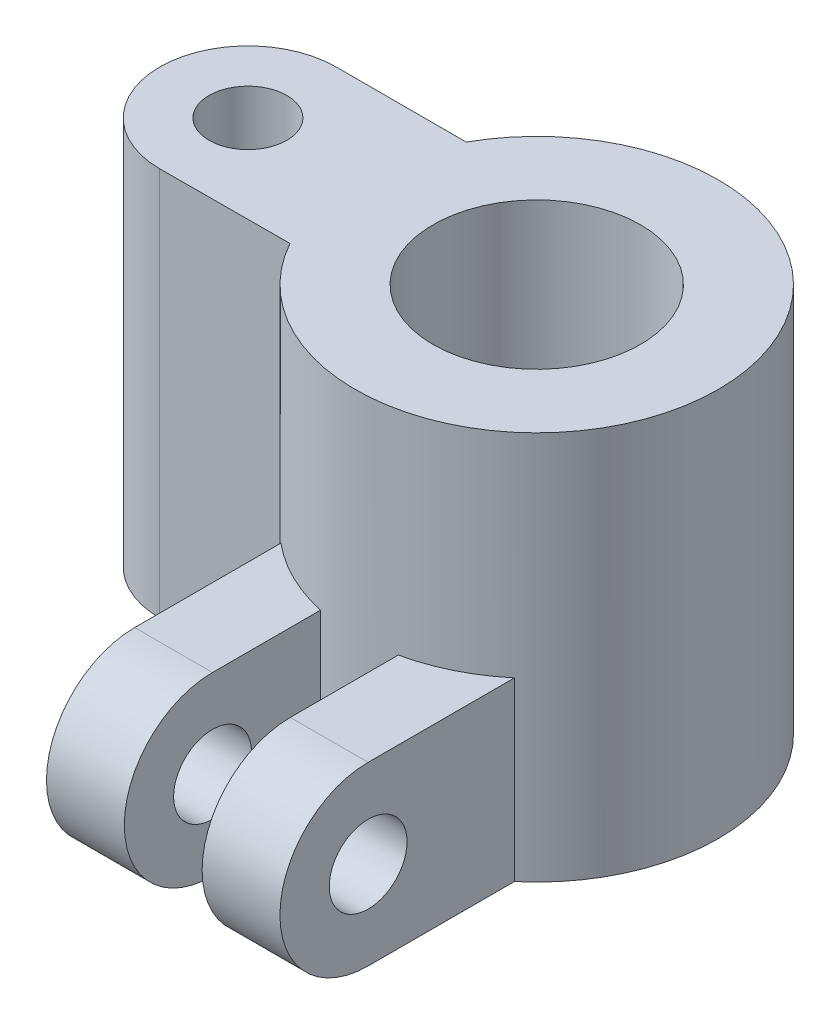
ISO-10303-21;
HEADER;
FILE_DESCRIPTION(('STEP AP214'),'2;1');
FILE_NAME('part.step','',(''),(''),'','','');
FILE_SCHEMA(('AUTOMOTIVE_DESIGN { 1 0 10303 214 1 1 1 1 }'));
ENDSEC;
DATA;
#1=APPLICATION_CONTEXT('core data for automotive mechanical design processes');
#2=APPLICATION_PROTOCOL_DEFINITION('international standard','automotive_design',2000,#1);
#3=PRODUCT_CONTEXT('',#1,'mechanical');
#4=PRODUCT('Part','Part','',(#3));
#5=PRODUCT_RELATED_PRODUCT_CATEGORY('part','',(#4));
#6=PRODUCT_DEFINITION_FORMATION('','',#4);
#7=PRODUCT_DEFINITION_CONTEXT('part definition',#1,'design');
#8=PRODUCT_DEFINITION('design','',#6,#7);
#9=PRODUCT_DEFINITION_SHAPE('','',#8);
#10=(LENGTH_UNIT() NAMED_UNIT(*) SI_UNIT(.MILLI.,.METRE.));
#11=(NAMED_UNIT(*) PLANE_ANGLE_UNIT() SI_UNIT($,.RADIAN.));
#12=(NAMED_UNIT(*) SI_UNIT($,.STERADIAN.) SOLID_ANGLE_UNIT());
#13=UNCERTAINTY_MEASURE_WITH_UNIT(LENGTH_MEASURE(1.E-05),#10,'distance_accuracy_value','');
#14=(GEOMETRIC_REPRESENTATION_CONTEXT(3) GLOBAL_UNCERTAINTY_ASSIGNED_CONTEXT((#13)) GLOBAL_UNIT_ASSIGNED_CONTEXT((#10,
#11,#12)) REPRESENTATION_CONTEXT('',''));
#15=CARTESIAN_POINT('',(0.,0.,0.));
#16=DIRECTION('',(0.,0.,1.));
#17=DIRECTION('',(1.,0.,0.));
#18=AXIS2_PLACEMENT_3D('',#15,#16,#17);
#19=CARTESIAN_POINT('',(7.500000000001,34.,1.02533666085625E-13));
#20=DIRECTION('',(1.,0.,0.));
#21=DIRECTION('',(0.,0.,-1.));
#22=AXIS2_PLACEMENT_3D('',#19,#20,#21);
#23=PLANE('',#22);
#24=CARTESIAN_POINT('',(7.50000000000024,17.,54.9999999999999));
#25=DIRECTION('',(1.,0.,0.));
#26=DIRECTION('',(0.,0.,-1.));
#27=AXIS2_PLACEMENT_3D('',#24,#25,#26);
#28=CIRCLE('',#27,7.5);
#29=CARTESIAN_POINT('',(7.50000000000034,17.,47.4999999999999));
#30=VERTEX_POINT('',#29);
#31=EDGE_CURVE('E340',#30,#30,#28,.F.);
#32=ORIENTED_EDGE('',*,*,#31,.F.);
#33=EDGE_LOOP('',(#32));
#34=FACE_BOUND('',#33,.T.);
#35=DIRECTION('',(0.,0.,1.));
#36=VECTOR('',#35,1.);
#37=CARTESIAN_POINT('',(7.500000000001,0.,1.02533666085625E-13));
#38=LINE('',#37,#36);
#39=CARTESIAN_POINT('',(7.50000000000053,0.,34.1869858279432));
#40=VERTEX_POINT('',#39);
#41=CARTESIAN_POINT('',(7.50000000000012,0.,54.9999999999999));
#42=VERTEX_POINT('',#41);
#43=EDGE_CURVE('E234',#40,#42,#38,.T.);
#44=ORIENTED_EDGE('',*,*,#43,.T.);
#45=CARTESIAN_POINT('',(7.50000000000024,17.,54.9999999999999));
#46=DIRECTION('',(1.,0.,0.));
#47=DIRECTION('',(0.,0.,-1.));
#48=AXIS2_PLACEMENT_3D('',#45,#46,#47);
#49=CIRCLE('',#48,17.);
#50=CARTESIAN_POINT('',(7.50000000000025,34.,54.9999999999998));
#51=VERTEX_POINT('',#50);
#52=EDGE_CURVE('E219',#42,#51,#49,.F.);
#53=ORIENTED_EDGE('',*,*,#52,.T.);
#54=DIRECTION('',(0.,0.,1.));
#55=VECTOR('',#54,1.);
#56=CARTESIAN_POINT('',(7.500000000001,34.,1.02533666085625E-13));
#57=LINE('',#56,#55);
#58=CARTESIAN_POINT('',(7.50000000000052,34.,34.1869858279432));
#59=VERTEX_POINT('',#58);
#60=EDGE_CURVE('E236',#59,#51,#57,.T.);
#61=ORIENTED_EDGE('',*,*,#60,.F.);
#62=DIRECTION('',(0.,-1.,0.));
#63=VECTOR('',#62,1.);
#64=CARTESIAN_POINT('',(7.50000000000053,34.,34.1869858279433));
#65=LINE('',#64,#63);
#66=EDGE_CURVE('E244',#59,#40,#65,.T.);
#67=ORIENTED_EDGE('',*,*,#66,.T.);
#68=EDGE_LOOP('',(#44,#53,#61,#67));
#69=FACE_BOUND('',#68,.T.);
#70=ADVANCED_FACE('F123',(#34,#69),#23,.F.);
#71=CARTESIAN_POINT('',(22.5000000000003,34.,-1.53739603596427E-13));
#72=DIRECTION('',(1.,0.,0.));
#73=DIRECTION('',(0.,0.,-1.));
#74=AXIS2_PLACEMENT_3D('',#71,#72,#73);
#75=PLANE('',#74);
#76=CARTESIAN_POINT('',(22.5000000000007,17.,54.9999999999998));
#77=DIRECTION('',(1.,0.,0.));
#78=DIRECTION('',(0.,0.,-1.));
#79=AXIS2_PLACEMENT_3D('',#76,#77,#78);
#80=CIRCLE('',#79,7.5);
#81=CARTESIAN_POINT('',(22.5000000000006,17.,47.4999999999998));
#82=VERTEX_POINT('',#81);
#83=EDGE_CURVE('E343',#82,#82,#80,.T.);
#84=ORIENTED_EDGE('',*,*,#83,.F.);
#85=EDGE_LOOP('',(#84));
#86=FACE_BOUND('',#85,.T.);
#87=CARTESIAN_POINT('',(22.5000000000007,17.,54.9999999999998));
#88=DIRECTION('',(1.,0.,0.));
#89=DIRECTION('',(0.,0.,-1.));
#90=AXIS2_PLACEMENT_3D('',#87,#88,#89);
#91=CIRCLE('',#90,17.);
#92=CARTESIAN_POINT('',(22.5000000000007,34.,54.9999999999998));
#93=VERTEX_POINT('',#92);
#94=CARTESIAN_POINT('',(22.5000000000007,0.,54.9999999999998));
#95=VERTEX_POINT('',#94);
#96=EDGE_CURVE('E138',#93,#95,#91,.T.);
#97=ORIENTED_EDGE('',*,*,#96,.T.);
#98=DIRECTION('',(0.,0.,1.));
#99=VECTOR('',#98,1.);
#100=CARTESIAN_POINT('',(22.5000000000003,0.,-1.53739603596427E-13));
#101=LINE('',#100,#99);
#102=CARTESIAN_POINT('',(22.5000000000005,0.,26.8095132369089));
#103=VERTEX_POINT('',#102);
#104=EDGE_CURVE('E215',#103,#95,#101,.T.);
#105=ORIENTED_EDGE('',*,*,#104,.F.);
#106=DIRECTION('',(0.,-1.,0.));
#107=VECTOR('',#106,1.);
#108=CARTESIAN_POINT('',(22.5000000000005,34.,26.8095132369089));
#109=LINE('',#108,#107);
#110=CARTESIAN_POINT('',(22.5000000000003,34.,26.8095132369087));
#111=VERTEX_POINT('',#110);
#112=EDGE_CURVE('E242',#111,#103,#109,.T.);
#113=ORIENTED_EDGE('',*,*,#112,.F.);
#114=DIRECTION('',(0.,0.,1.));
#115=VECTOR('',#114,1.);
#116=CARTESIAN_POINT('',(22.5000000000003,34.,-1.53739603596427E-13));
#117=LINE('',#116,#115);
#118=EDGE_CURVE('E217',#111,#93,#117,.T.);
#119=ORIENTED_EDGE('',*,*,#118,.T.);
#120=EDGE_LOOP('',(#97,#105,#113,#119));
#121=FACE_BOUND('',#120,.T.);
#122=ADVANCED_FACE('F212',(#86,#121),#75,.T.);
#123=CARTESIAN_POINT('',(0.,0.,0.));
#124=DIRECTION('',(0.,1.,0.));
#125=DIRECTION('',(0.,0.,1.));
#126=AXIS2_PLACEMENT_3D('',#123,#124,#125);
#127=PLANE('',#126);
#128=CARTESIAN_POINT('',(0.,0.,0.));
#129=DIRECTION('',(0.,1.,0.));
#130=DIRECTION('',(0.,0.,1.));
#131=AXIS2_PLACEMENT_3D('',#128,#129,#130);
#132=CIRCLE('',#131,20.);
#133=CARTESIAN_POINT('',(0.,0.,20.));
#134=VERTEX_POINT('',#133);
#135=EDGE_CURVE('E287',#134,#134,#132,.T.);
#136=ORIENTED_EDGE('',*,*,#135,.T.);
#137=EDGE_LOOP('',(#136));
#138=FACE_BOUND('',#137,.T.);
#139=CARTESIAN_POINT('',(-55.6683295772882,0.,0.));
#140=DIRECTION('',(0.,1.,0.));
#141=DIRECTION('',(0.,0.,1.));
#142=AXIS2_PLACEMENT_3D('',#139,#140,#141);
#143=CIRCLE('',#142,7.5);
#144=CARTESIAN_POINT('',(-55.6683295772882,0.,7.5));
#145=VERTEX_POINT('',#144);
#146=EDGE_CURVE('E267',#145,#145,#143,.T.);
#147=ORIENTED_EDGE('',*,*,#146,.T.);
#148=EDGE_LOOP('',(#147));
#149=FACE_BOUND('',#148,.T.);
#150=DIRECTION('',(1.,0.,0.));
#151=VECTOR('',#150,1.);
#152=CARTESIAN_POINT('',(-72.6693295772883,0.,55.0000000000005));
#153=LINE('',#152,#151);
#154=EDGE_CURVE('E222',#42,#95,#153,.T.);
#155=ORIENTED_EDGE('',*,*,#154,.F.);
#156=ORIENTED_EDGE('',*,*,#43,.F.);
#157=CARTESIAN_POINT('',(0.,0.,0.));
#158=DIRECTION('',(0.,1.,0.));
#159=DIRECTION('',(0.,0.,1.));
#160=AXIS2_PLACEMENT_3D('',#157,#158,#159);
#161=CIRCLE('',#160,35.);
#162=CARTESIAN_POINT('',(-7.49999999999999,0.,34.1869858279434));
#163=VERTEX_POINT('',#162);
#164=EDGE_CURVE('E293',#163,#40,#161,.T.);
#165=ORIENTED_EDGE('',*,*,#164,.F.);
#166=DIRECTION('',(0.,0.,1.));
#167=VECTOR('',#166,1.);
#168=CARTESIAN_POINT('',(-7.49999999999999,0.,0.));
#169=LINE('',#168,#167);
#170=CARTESIAN_POINT('',(-7.49999999999999,0.,55.));
#171=VERTEX_POINT('',#170);
#172=EDGE_CURVE('E251',#163,#171,#169,.T.);
#173=ORIENTED_EDGE('',*,*,#172,.T.);
#174=DIRECTION('',(-1.,0.,0.));
#175=VECTOR('',#174,1.);
#176=CARTESIAN_POINT('',(35.001,0.,55.));
#177=LINE('',#176,#175);
#178=CARTESIAN_POINT('',(-22.5,0.,55.));
#179=VERTEX_POINT('',#178);
#180=EDGE_CURVE('E146',#171,#179,#177,.T.);
#181=ORIENTED_EDGE('',*,*,#180,.T.);
#182=DIRECTION('',(0.,0.,1.));
#183=VECTOR('',#182,1.);
#184=CARTESIAN_POINT('',(-22.5,0.,0.));
#185=LINE('',#184,#183);
#186=CARTESIAN_POINT('',(-22.5,0.,26.809513236909));
#187=VERTEX_POINT('',#186);
#188=EDGE_CURVE('E247',#187,#179,#185,.T.);
#189=ORIENTED_EDGE('',*,*,#188,.F.);
#190=CARTESIAN_POINT('',(-30.643296935823,0.,16.9111901681395));
#191=VERTEX_POINT('',#190);
#192=EDGE_CURVE('E290',#191,#187,#161,.T.);
#193=ORIENTED_EDGE('',*,*,#192,.F.);
#194=DIRECTION('',(0.999993702927513,0.,-0.00354881745374228));
#195=VECTOR('',#194,1.);
#196=CARTESIAN_POINT('',(0.059628424006202,0.,16.8022304046141));
#197=LINE('',#196,#195);
#198=CARTESIAN_POINT('',(-55.6683295772882,0.,17.));
#199=VERTEX_POINT('',#198);
#200=EDGE_CURVE('E272',#199,#191,#197,.T.);
#201=ORIENTED_EDGE('',*,*,#200,.F.);
#202=CARTESIAN_POINT('',(-55.6683295772882,0.,0.));
#203=DIRECTION('',(0.,1.,0.));
#204=DIRECTION('',(0.,0.,1.));
#205=AXIS2_PLACEMENT_3D('',#202,#203,#204);
#206=CIRCLE('',#205,17.);
#207=CARTESIAN_POINT('',(-55.6683295772882,0.,-17.));
#208=VERTEX_POINT('',#207);
#209=EDGE_CURVE('E295',#208,#199,#206,.T.);
#210=ORIENTED_EDGE('',*,*,#209,.F.);
#211=DIRECTION('',(1.,0.,0.));
#212=VECTOR('',#211,1.);
#213=CARTESIAN_POINT('',(0.,0.,-17.));
#214=LINE('',#213,#212);
#215=CARTESIAN_POINT('',(-30.5941170815567,0.,-17.));
#216=VERTEX_POINT('',#215);
#217=EDGE_CURVE('E292',#208,#216,#214,.T.);
#218=ORIENTED_EDGE('',*,*,#217,.T.);
#219=EDGE_CURVE('E231',#103,#216,#161,.T.);
#220=ORIENTED_EDGE('',*,*,#219,.F.);
#221=ORIENTED_EDGE('',*,*,#104,.T.);
#222=EDGE_LOOP('',(#155,#156,#165,#173,#181,#189,#193,#201,#210,#218,#220,#221));
#223=FACE_BOUND('',#222,.T.);
#224=ADVANCED_FACE('F229',(#138,#149,#223),#127,.F.);
#225=CARTESIAN_POINT('',(0.,34.,0.));
#226=DIRECTION('',(0.,1.,0.));
#227=DIRECTION('',(0.,0.,1.));
#228=AXIS2_PLACEMENT_3D('',#225,#226,#227);
#229=PLANE('',#228);
#230=ORIENTED_EDGE('',*,*,#60,.T.);
#231=DIRECTION('',(1.,0.,0.));
#232=VECTOR('',#231,1.);
#233=CARTESIAN_POINT('',(-72.6693295772883,34.,55.0000000000004));
#234=LINE('',#233,#232);
#235=EDGE_CURVE('E218',#51,#93,#234,.T.);
#236=ORIENTED_EDGE('',*,*,#235,.T.);
#237=ORIENTED_EDGE('',*,*,#118,.F.);
#238=CARTESIAN_POINT('',(0.,34.,0.));
#239=DIRECTION('',(0.,1.,0.));
#240=DIRECTION('',(0.,0.,1.));
#241=AXIS2_PLACEMENT_3D('',#238,#239,#240);
#242=CIRCLE('',#241,35.);
#243=EDGE_CURVE('E233',#59,#111,#242,.T.);
#244=ORIENTED_EDGE('',*,*,#243,.F.);
#245=EDGE_LOOP('',(#230,#236,#237,#244));
#246=FACE_BOUND('',#245,.T.);
#247=ADVANCED_FACE('F325',(#246),#229,.T.);
#248=CARTESIAN_POINT('',(-22.5,34.,0.));
#249=DIRECTION('',(1.,0.,0.));
#250=DIRECTION('',(0.,0.,-1.));
#251=AXIS2_PLACEMENT_3D('',#248,#249,#250);
#252=PLANE('',#251);
#253=CARTESIAN_POINT('',(-22.5,17.,55.));
#254=DIRECTION('',(-1.,0.,0.));
#255=DIRECTION('',(0.,0.,1.));
#256=AXIS2_PLACEMENT_3D('',#253,#254,#255);
#257=CIRCLE('',#256,7.5);
#258=CARTESIAN_POINT('',(-22.5,17.,62.5));
#259=VERTEX_POINT('',#258);
#260=EDGE_CURVE('E334',#259,#259,#257,.T.);
#261=ORIENTED_EDGE('',*,*,#260,.F.);
#262=EDGE_LOOP('',(#261));
#263=FACE_BOUND('',#262,.T.);
#264=CARTESIAN_POINT('',(-22.5,17.,55.));
#265=DIRECTION('',(-1.,0.,0.));
#266=DIRECTION('',(0.,0.,1.));
#267=AXIS2_PLACEMENT_3D('',#264,#265,#266);
#268=CIRCLE('',#267,17.);
#269=CARTESIAN_POINT('',(-22.5,34.,55.));
#270=VERTEX_POINT('',#269);
#271=EDGE_CURVE('E328',#179,#270,#268,.T.);
#272=ORIENTED_EDGE('',*,*,#271,.T.);
#273=DIRECTION('',(0.,0.,1.));
#274=VECTOR('',#273,1.);
#275=CARTESIAN_POINT('',(-22.5,34.,0.));
#276=LINE('',#275,#274);
#277=CARTESIAN_POINT('',(-22.5,34.,26.809513236909));
#278=VERTEX_POINT('',#277);
#279=EDGE_CURVE('E250',#278,#270,#276,.T.);
#280=ORIENTED_EDGE('',*,*,#279,.F.);
#281=DIRECTION('',(0.,-1.,0.));
#282=VECTOR('',#281,1.);
#283=CARTESIAN_POINT('',(-22.5,34.,26.809513236909));
#284=LINE('',#283,#282);
#285=EDGE_CURVE('E264',#278,#187,#284,.T.);
#286=ORIENTED_EDGE('',*,*,#285,.T.);
#287=ORIENTED_EDGE('',*,*,#188,.T.);
#288=EDGE_LOOP('',(#272,#280,#286,#287));
#289=FACE_BOUND('',#288,.T.);
#290=ADVANCED_FACE('F374',(#263,#289),#252,.F.);
#291=CARTESIAN_POINT('',(-7.49999999999999,34.,0.));
#292=DIRECTION('',(1.,0.,0.));
#293=DIRECTION('',(0.,0.,-1.));
#294=AXIS2_PLACEMENT_3D('',#291,#292,#293);
#295=PLANE('',#294);
#296=CARTESIAN_POINT('',(-7.49999999999999,17.,55.));
#297=DIRECTION('',(1.,0.,0.));
#298=DIRECTION('',(0.,0.,-1.));
#299=AXIS2_PLACEMENT_3D('',#296,#297,#298);
#300=CIRCLE('',#299,7.5);
#301=CARTESIAN_POINT('',(-7.49999999999999,17.,62.5));
#302=VERTEX_POINT('',#301);
#303=EDGE_CURVE('E337',#302,#302,#300,.F.);
#304=ORIENTED_EDGE('',*,*,#303,.T.);
#305=EDGE_LOOP('',(#304));
#306=FACE_BOUND('',#305,.T.);
#307=DIRECTION('',(0.,0.,1.));
#308=VECTOR('',#307,1.);
#309=CARTESIAN_POINT('',(-7.49999999999999,34.,0.));
#310=LINE('',#309,#308);
#311=CARTESIAN_POINT('',(-7.49999999999999,34.,34.1869858279434));
#312=VERTEX_POINT('',#311);
#313=CARTESIAN_POINT('',(-7.49999999999999,34.,55.));
#314=VERTEX_POINT('',#313);
#315=EDGE_CURVE('E254',#312,#314,#310,.T.);
#316=ORIENTED_EDGE('',*,*,#315,.T.);
#317=CARTESIAN_POINT('',(-7.49999999999999,17.,55.));
#318=DIRECTION('',(1.,0.,0.));
#319=DIRECTION('',(0.,0.,-1.));
#320=AXIS2_PLACEMENT_3D('',#317,#318,#319);
#321=CIRCLE('',#320,17.);
#322=EDGE_CURVE('E238',#171,#314,#321,.F.);
#323=ORIENTED_EDGE('',*,*,#322,.F.);
#324=ORIENTED_EDGE('',*,*,#172,.F.);
#325=DIRECTION('',(0.,-1.,0.));
#326=VECTOR('',#325,1.);
#327=CARTESIAN_POINT('',(-7.49999999999999,34.,34.1869858279434));
#328=LINE('',#327,#326);
#329=EDGE_CURVE('E257',#312,#163,#328,.T.);
#330=ORIENTED_EDGE('',*,*,#329,.F.);
#331=EDGE_LOOP('',(#316,#323,#324,#330));
#332=FACE_BOUND('',#331,.T.);
#333=ADVANCED_FACE('F371',(#306,#332),#295,.T.);
#334=CARTESIAN_POINT('',(0.,75.,0.));
#335=DIRECTION('',(0.,-1.,0.));
#336=DIRECTION('',(0.,0.,-1.));
#337=AXIS2_PLACEMENT_3D('',#334,#335,#336);
#338=CYLINDRICAL_SURFACE('',#337,35.);
#339=ORIENTED_EDGE('',*,*,#66,.F.);
#340=ORIENTED_EDGE('',*,*,#243,.T.);
#341=ORIENTED_EDGE('',*,*,#112,.T.);
#342=ORIENTED_EDGE('',*,*,#219,.T.);
#343=DIRECTION('',(0.,-1.,0.));
#344=VECTOR('',#343,1.);
#345=CARTESIAN_POINT('',(-30.5941170815567,75.,-17.));
#346=LINE('',#345,#344);
#347=CARTESIAN_POINT('',(-30.5941170815567,75.,-17.));
#348=VERTEX_POINT('',#347);
#349=EDGE_CURVE('E12',#348,#216,#346,.T.);
#350=ORIENTED_EDGE('',*,*,#349,.F.);
#351=CARTESIAN_POINT('',(0.,75.,0.));
#352=DIRECTION('',(0.,1.,0.));
#353=DIRECTION('',(0.,0.,1.));
#354=AXIS2_PLACEMENT_3D('',#351,#352,#353);
#355=CIRCLE('',#354,35.);
#356=CARTESIAN_POINT('',(-30.643296935823,75.,16.9111901681395));
#357=VERTEX_POINT('',#356);
#358=EDGE_CURVE('E275',#357,#348,#355,.T.);
#359=ORIENTED_EDGE('',*,*,#358,.F.);
#360=DIRECTION('',(0.,-1.,0.));
#361=VECTOR('',#360,1.);
#362=CARTESIAN_POINT('',(-30.643296935823,75.,16.9111901681395));
#363=LINE('',#362,#361);
#364=EDGE_CURVE('E284',#357,#191,#363,.T.);
#365=ORIENTED_EDGE('',*,*,#364,.T.);
#366=ORIENTED_EDGE('',*,*,#192,.T.);
#367=ORIENTED_EDGE('',*,*,#285,.F.);
#368=CARTESIAN_POINT('',(0.,34.,0.));
#369=DIRECTION('',(0.,1.,0.));
#370=DIRECTION('',(0.,0.,1.));
#371=AXIS2_PLACEMENT_3D('',#368,#369,#370);
#372=CIRCLE('',#371,35.);
#373=EDGE_CURVE('E248',#278,#312,#372,.T.);
#374=ORIENTED_EDGE('',*,*,#373,.T.);
#375=ORIENTED_EDGE('',*,*,#329,.T.);
#376=ORIENTED_EDGE('',*,*,#164,.T.);
#377=EDGE_LOOP('',(#339,#340,#341,#342,#350,#359,#365,#366,#367,#374,#375,#376));
#378=FACE_BOUND('',#377,.T.);
#379=ADVANCED_FACE('F316',(#378),#338,.T.);
#380=CARTESIAN_POINT('',(0.,75.,-17.));
#381=DIRECTION('',(0.,0.,-1.));
#382=DIRECTION('',(-1.,0.,0.));
#383=AXIS2_PLACEMENT_3D('',#380,#381,#382);
#384=PLANE('',#383);
#385=ORIENTED_EDGE('',*,*,#217,.F.);
#386=DIRECTION('',(0.,-1.,0.));
#387=VECTOR('',#386,1.);
#388=CARTESIAN_POINT('',(-55.6683295772882,75.,-17.));
#389=LINE('',#388,#387);
#390=CARTESIAN_POINT('',(-55.6683295772882,75.,-17.));
#391=VERTEX_POINT('',#390);
#392=EDGE_CURVE('E131',#391,#208,#389,.T.);
#393=ORIENTED_EDGE('',*,*,#392,.F.);
#394=DIRECTION('',(1.,0.,0.));
#395=VECTOR('',#394,1.);
#396=CARTESIAN_POINT('',(0.,75.,-17.));
#397=LINE('',#396,#395);
#398=EDGE_CURVE('E277',#391,#348,#397,.T.);
#399=ORIENTED_EDGE('',*,*,#398,.T.);
#400=ORIENTED_EDGE('',*,*,#349,.T.);
#401=EDGE_LOOP('',(#385,#393,#399,#400));
#402=FACE_BOUND('',#401,.T.);
#403=ADVANCED_FACE('F312',(#402),#384,.T.);
#404=CARTESIAN_POINT('',(-55.6683295772882,75.,0.));
#405=DIRECTION('',(0.,-1.,0.));
#406=DIRECTION('',(0.,0.,-1.));
#407=AXIS2_PLACEMENT_3D('',#404,#405,#406);
#408=CYLINDRICAL_SURFACE('',#407,17.);
#409=ORIENTED_EDGE('',*,*,#209,.T.);
#410=DIRECTION('',(0.,-1.,0.));
#411=VECTOR('',#410,1.);
#412=CARTESIAN_POINT('',(-55.6683295772882,75.,17.));
#413=LINE('',#412,#411);
#414=CARTESIAN_POINT('',(-55.6683295772882,75.,17.));
#415=VERTEX_POINT('',#414);
#416=EDGE_CURVE('E300',#415,#199,#413,.T.);
#417=ORIENTED_EDGE('',*,*,#416,.F.);
#418=CARTESIAN_POINT('',(-55.6683295772882,75.,0.));
#419=DIRECTION('',(0.,1.,0.));
#420=DIRECTION('',(0.,0.,1.));
#421=AXIS2_PLACEMENT_3D('',#418,#419,#420);
#422=CIRCLE('',#421,17.);
#423=EDGE_CURVE('E280',#391,#415,#422,.T.);
#424=ORIENTED_EDGE('',*,*,#423,.F.);
#425=ORIENTED_EDGE('',*,*,#392,.T.);
#426=EDGE_LOOP('',(#409,#417,#424,#425));
#427=FACE_BOUND('',#426,.T.);
#428=ADVANCED_FACE('F305',(#427),#408,.T.);
#429=CARTESIAN_POINT('',(0.,75.,0.));
#430=DIRECTION('',(0.,-1.,0.));
#431=DIRECTION('',(0.,0.,-1.));
#432=AXIS2_PLACEMENT_3D('',#429,#430,#431);
#433=CYLINDRICAL_SURFACE('',#432,20.);
#434=CARTESIAN_POINT('',(0.,75.,0.));
#435=DIRECTION('',(0.,1.,0.));
#436=DIRECTION('',(0.,0.,1.));
#437=AXIS2_PLACEMENT_3D('',#434,#435,#436);
#438=CIRCLE('',#437,20.);
#439=CARTESIAN_POINT('',(0.,75.,20.));
#440=VERTEX_POINT('',#439);
#441=EDGE_CURVE('E271',#440,#440,#438,.T.);
#442=ORIENTED_EDGE('',*,*,#441,.T.);
#443=EDGE_LOOP('',(#442));
#444=FACE_BOUND('',#443,.T.);
#445=ORIENTED_EDGE('',*,*,#135,.F.);
#446=EDGE_LOOP('',(#445));
#447=FACE_BOUND('',#446,.T.);
#448=ADVANCED_FACE('F388',(#444,#447),#433,.F.);
#449=CARTESIAN_POINT('',(-55.6683295772882,75.,0.));
#450=DIRECTION('',(0.,-1.,0.));
#451=DIRECTION('',(0.,0.,-1.));
#452=AXIS2_PLACEMENT_3D('',#449,#450,#451);
#453=CYLINDRICAL_SURFACE('',#452,7.5);
#454=CARTESIAN_POINT('',(-55.6683295772882,75.,0.));
#455=DIRECTION('',(0.,1.,0.));
#456=DIRECTION('',(0.,0.,1.));
#457=AXIS2_PLACEMENT_3D('',#454,#455,#456);
#458=CIRCLE('',#457,7.5);
#459=CARTESIAN_POINT('',(-55.6683295772882,75.,7.5));
#460=VERTEX_POINT('',#459);
#461=EDGE_CURVE('E268',#460,#460,#458,.T.);
#462=ORIENTED_EDGE('',*,*,#461,.T.);
#463=EDGE_LOOP('',(#462));
#464=FACE_BOUND('',#463,.T.);
#465=ORIENTED_EDGE('',*,*,#146,.F.);
#466=EDGE_LOOP('',(#465));
#467=FACE_BOUND('',#466,.T.);
#468=ADVANCED_FACE('F125',(#464,#467),#453,.F.);
#469=CARTESIAN_POINT('',(0.059628424006202,75.,16.8022304046141));
#470=DIRECTION('',(-0.00354881745374228,0.,-0.999993702927513));
#471=DIRECTION('',(-0.999993702927513,0.,0.00354881745374228));
#472=AXIS2_PLACEMENT_3D('',#469,#470,#471);
#473=PLANE('',#472);
#474=ORIENTED_EDGE('',*,*,#200,.T.);
#475=ORIENTED_EDGE('',*,*,#364,.F.);
#476=DIRECTION('',(0.999993702927513,0.,-0.00354881745374228));
#477=VECTOR('',#476,1.);
#478=CARTESIAN_POINT('',(0.059628424006202,75.,16.8022304046141));
#479=LINE('',#478,#477);
#480=EDGE_CURVE('E282',#415,#357,#479,.T.);
#481=ORIENTED_EDGE('',*,*,#480,.F.);
#482=ORIENTED_EDGE('',*,*,#416,.T.);
#483=EDGE_LOOP('',(#474,#475,#481,#482));
#484=FACE_BOUND('',#483,.T.);
#485=ADVANCED_FACE('F380',(#484),#473,.F.);
#486=CARTESIAN_POINT('',(0.,75.,0.));
#487=DIRECTION('',(0.,1.,0.));
#488=DIRECTION('',(0.,0.,1.));
#489=AXIS2_PLACEMENT_3D('',#486,#487,#488);
#490=PLANE('',#489);
#491=ORIENTED_EDGE('',*,*,#461,.F.);
#492=EDGE_LOOP('',(#491));
#493=FACE_BOUND('',#492,.T.);
#494=ORIENTED_EDGE('',*,*,#441,.F.);
#495=EDGE_LOOP('',(#494));
#496=FACE_BOUND('',#495,.T.);
#497=ORIENTED_EDGE('',*,*,#358,.T.);
#498=ORIENTED_EDGE('',*,*,#398,.F.);
#499=ORIENTED_EDGE('',*,*,#423,.T.);
#500=ORIENTED_EDGE('',*,*,#480,.T.);
#501=EDGE_LOOP('',(#497,#498,#499,#500));
#502=FACE_BOUND('',#501,.T.);
#503=ADVANCED_FACE('F369',(#493,#496,#502),#490,.T.);
#504=CARTESIAN_POINT('',(0.,34.,0.));
#505=DIRECTION('',(0.,1.,0.));
#506=DIRECTION('',(0.,0.,1.));
#507=AXIS2_PLACEMENT_3D('',#504,#505,#506);
#508=PLANE('',#507);
#509=DIRECTION('',(-1.,0.,0.));
#510=VECTOR('',#509,1.);
#511=CARTESIAN_POINT('',(35.001,34.,55.));
#512=LINE('',#511,#510);
#513=EDGE_CURVE('E329',#314,#270,#512,.T.);
#514=ORIENTED_EDGE('',*,*,#513,.F.);
#515=ORIENTED_EDGE('',*,*,#315,.F.);
#516=ORIENTED_EDGE('',*,*,#373,.F.);
#517=ORIENTED_EDGE('',*,*,#279,.T.);
#518=EDGE_LOOP('',(#514,#515,#516,#517));
#519=FACE_BOUND('',#518,.T.);
#520=ADVANCED_FACE('F365',(#519),#508,.T.);
#521=CARTESIAN_POINT('',(35.001,17.,55.));
#522=DIRECTION('',(-1.,0.,0.));
#523=DIRECTION('',(0.,0.,1.));
#524=AXIS2_PLACEMENT_3D('',#521,#522,#523);
#525=CYLINDRICAL_SURFACE('',#524,17.);
#526=ORIENTED_EDGE('',*,*,#322,.T.);
#527=ORIENTED_EDGE('',*,*,#513,.T.);
#528=ORIENTED_EDGE('',*,*,#271,.F.);
#529=ORIENTED_EDGE('',*,*,#180,.F.);
#530=EDGE_LOOP('',(#526,#527,#528,#529));
#531=FACE_BOUND('',#530,.T.);
#532=ADVANCED_FACE('F368',(#531),#525,.T.);
#533=CARTESIAN_POINT('',(35.001,17.,55.));
#534=DIRECTION('',(-1.,0.,0.));
#535=DIRECTION('',(0.,0.,1.));
#536=AXIS2_PLACEMENT_3D('',#533,#534,#535);
#537=CYLINDRICAL_SURFACE('',#536,7.5);
#538=CARTESIAN_POINT('',(-7.49999999999999,17.,62.5));
#539=CARTESIAN_POINT('',(-7.65624999999998,17.,62.5));
#540=CARTESIAN_POINT('',(-7.81249999999998,17.,62.5));
#541=CARTESIAN_POINT('',(-8.12499999999998,17.,62.5));
#542=CARTESIAN_POINT('',(-8.28124999999998,17.,62.5));
#543=CARTESIAN_POINT('',(-8.59374999999999,17.,62.5));
#544=CARTESIAN_POINT('',(-8.74999999999999,17.,62.5));
#545=CARTESIAN_POINT('',(-9.06249999999999,17.,62.5));
#546=CARTESIAN_POINT('',(-9.21874999999999,17.,62.5));
#547=CARTESIAN_POINT('',(-9.53124999999999,17.,62.5));
#548=CARTESIAN_POINT('',(-9.68749999999999,17.,62.5));
#549=CARTESIAN_POINT('',(-9.99999999999999,17.,62.5));
#550=CARTESIAN_POINT('',(-10.15625,17.,62.5));
#551=CARTESIAN_POINT('',(-10.46875,17.,62.5));
#552=CARTESIAN_POINT('',(-10.625,17.,62.5));
#553=CARTESIAN_POINT('',(-10.9375,17.,62.5));
#554=CARTESIAN_POINT('',(-11.09375,17.,62.5));
#555=CARTESIAN_POINT('',(-11.40625,17.,62.5));
#556=CARTESIAN_POINT('',(-11.5625,17.,62.5));
#557=CARTESIAN_POINT('',(-11.875,17.,62.5));
#558=CARTESIAN_POINT('',(-12.03125,17.,62.5));
#559=CARTESIAN_POINT('',(-12.34375,17.,62.5));
#560=CARTESIAN_POINT('',(-12.5,17.,62.5));
#561=CARTESIAN_POINT('',(-12.8125,17.,62.5));
#562=CARTESIAN_POINT('',(-12.96875,17.,62.5));
#563=CARTESIAN_POINT('',(-13.28125,17.,62.5));
#564=CARTESIAN_POINT('',(-13.4375,17.,62.5));
#565=CARTESIAN_POINT('',(-13.75,17.,62.5));
#566=CARTESIAN_POINT('',(-13.90625,17.,62.5));
#567=CARTESIAN_POINT('',(-14.21875,17.,62.5));
#568=CARTESIAN_POINT('',(-14.375,17.,62.5));
#569=CARTESIAN_POINT('',(-14.6875,17.,62.5));
#570=CARTESIAN_POINT('',(-14.84375,17.,62.5));
#571=CARTESIAN_POINT('',(-15.15625,17.,62.5));
#572=CARTESIAN_POINT('',(-15.3125,17.,62.5));
#573=CARTESIAN_POINT('',(-15.625,17.,62.5));
#574=CARTESIAN_POINT('',(-15.78125,17.,62.5));
#575=CARTESIAN_POINT('',(-16.09375,17.,62.5));
#576=CARTESIAN_POINT('',(-16.25,17.,62.5));
#577=CARTESIAN_POINT('',(-16.5625,17.,62.5));
#578=CARTESIAN_POINT('',(-16.71875,17.,62.5));
#579=CARTESIAN_POINT('',(-17.03125,17.,62.5));
#580=CARTESIAN_POINT('',(-17.1875,17.,62.5));
#581=CARTESIAN_POINT('',(-17.5,17.,62.5));
#582=CARTESIAN_POINT('',(-17.65625,17.,62.5));
#583=CARTESIAN_POINT('',(-17.96875,17.,62.5));
#584=CARTESIAN_POINT('',(-18.125,17.,62.5));
#585=CARTESIAN_POINT('',(-18.4375,17.,62.5));
#586=CARTESIAN_POINT('',(-18.59375,17.,62.5));
#587=CARTESIAN_POINT('',(-18.90625,17.,62.5));
#588=CARTESIAN_POINT('',(-19.0625,17.,62.5));
#589=CARTESIAN_POINT('',(-19.375,17.,62.5));
#590=CARTESIAN_POINT('',(-19.53125,17.,62.5));
#591=CARTESIAN_POINT('',(-19.84375,17.,62.5));
#592=CARTESIAN_POINT('',(-20.,17.,62.5));
#593=CARTESIAN_POINT('',(-20.3125,17.,62.5));
#594=CARTESIAN_POINT('',(-20.46875,17.,62.5));
#595=CARTESIAN_POINT('',(-20.78125,17.,62.5));
#596=CARTESIAN_POINT('',(-20.9375,17.,62.5));
#597=CARTESIAN_POINT('',(-21.25,17.,62.5));
#598=CARTESIAN_POINT('',(-21.40625,17.,62.5));
#599=CARTESIAN_POINT('',(-21.71875,17.,62.5));
#600=CARTESIAN_POINT('',(-21.875,17.,62.5));
#601=CARTESIAN_POINT('',(-22.1875,17.,62.5));
#602=CARTESIAN_POINT('',(-22.34375,17.,62.5));
#603=CARTESIAN_POINT('',(-22.5,17.,62.5));
#604=B_SPLINE_CURVE_WITH_KNOTS('',3,(#538,#539,#540,#541,#542,#543,#544,#545,#546,#547,#548,
#549,#550,#551,#552,#553,#554,#555,#556,#557,#558,#559,#560,#561,#562,#563,#564,#565,#566,#567,
#568,#569,#570,#571,#572,#573,#574,#575,#576,#577,#578,#579,#580,#581,#582,#583,#584,#585,#586,
#587,#588,#589,#590,#591,#592,#593,#594,#595,#596,#597,#598,#599,#600,#601,#602,#603),
.UNSPECIFIED.,.F.,.F.,(4,2,2,2,2,2,2,2,2,2,2,2,2,2,2,2,2,2,2,2,2,2,2,2,2,2,2,2,2,2,2,2,4),(0.,
0.468749999999997,0.937500000000001,1.40625,1.875,2.34375,2.8125,3.28125,3.75,4.21875,4.6875,
5.15625,5.625,6.09375,6.5625,7.03125,7.5,7.96875,8.4375,8.90625,9.375,9.84375,10.3125,10.78125,
11.25,11.71875,12.1875,12.65625,13.125,13.59375,14.0625,14.53125,15.),.UNSPECIFIED.);
#605=EDGE_CURVE('BSEAM416',#302,#259,#604,.T.);
#606=ORIENTED_EDGE('',*,*,#303,.F.);
#607=ORIENTED_EDGE('',*,*,#260,.T.);
#608=ORIENTED_EDGE('',*,*,#605,.T.);
#609=ORIENTED_EDGE('',*,*,#605,.F.);
#610=EDGE_LOOP('',(#606,#608,#607,#609));
#611=FACE_BOUND('',#610,.T.);
#612=ADVANCED_FACE('F416',(#611),#537,.F.);
#613=CARTESIAN_POINT('',(-72.6693295772883,17.,55.0000000000005));
#614=DIRECTION('',(1.,0.,0.));
#615=DIRECTION('',(0.,0.,-1.));
#616=AXIS2_PLACEMENT_3D('',#613,#614,#615);
#617=CYLINDRICAL_SURFACE('',#616,17.);
#618=ORIENTED_EDGE('',*,*,#52,.F.);
#619=ORIENTED_EDGE('',*,*,#154,.T.);
#620=ORIENTED_EDGE('',*,*,#96,.F.);
#621=ORIENTED_EDGE('',*,*,#235,.F.);
#622=EDGE_LOOP('',(#618,#619,#620,#621));
#623=FACE_BOUND('',#622,.T.);
#624=ADVANCED_FACE('F223',(#623),#617,.T.);
#625=CARTESIAN_POINT('',(-72.6693295772883,17.,55.0000000000005));
#626=DIRECTION('',(1.,0.,0.));
#627=DIRECTION('',(0.,0.,-1.));
#628=AXIS2_PLACEMENT_3D('',#625,#626,#627);
#629=CYLINDRICAL_SURFACE('',#628,7.5);
#630=ORIENTED_EDGE('',*,*,#83,.T.);
#631=EDGE_LOOP('',(#630));
#632=FACE_BOUND('',#631,.T.);
#633=ORIENTED_EDGE('',*,*,#31,.T.);
#634=EDGE_LOOP('',(#633));
#635=FACE_BOUND('',#634,.T.);
#636=ADVANCED_FACE('F349',(#632,#635),#629,.F.);
#637=CLOSED_SHELL('',(#70,#122,#224,#247,#290,#333,#379,#403,#428,#448,#468,#485,#503,#520,#532,
#612,#624,#636));
#638=MANIFOLD_SOLID_BREP('B2',#637);
#639=ADVANCED_BREP_SHAPE_REPRESENTATION('',(#18,#638),#14);
#640=SHAPE_DEFINITION_REPRESENTATION(#9,#639);
ENDSEC;
END-ISO-10303-21;
